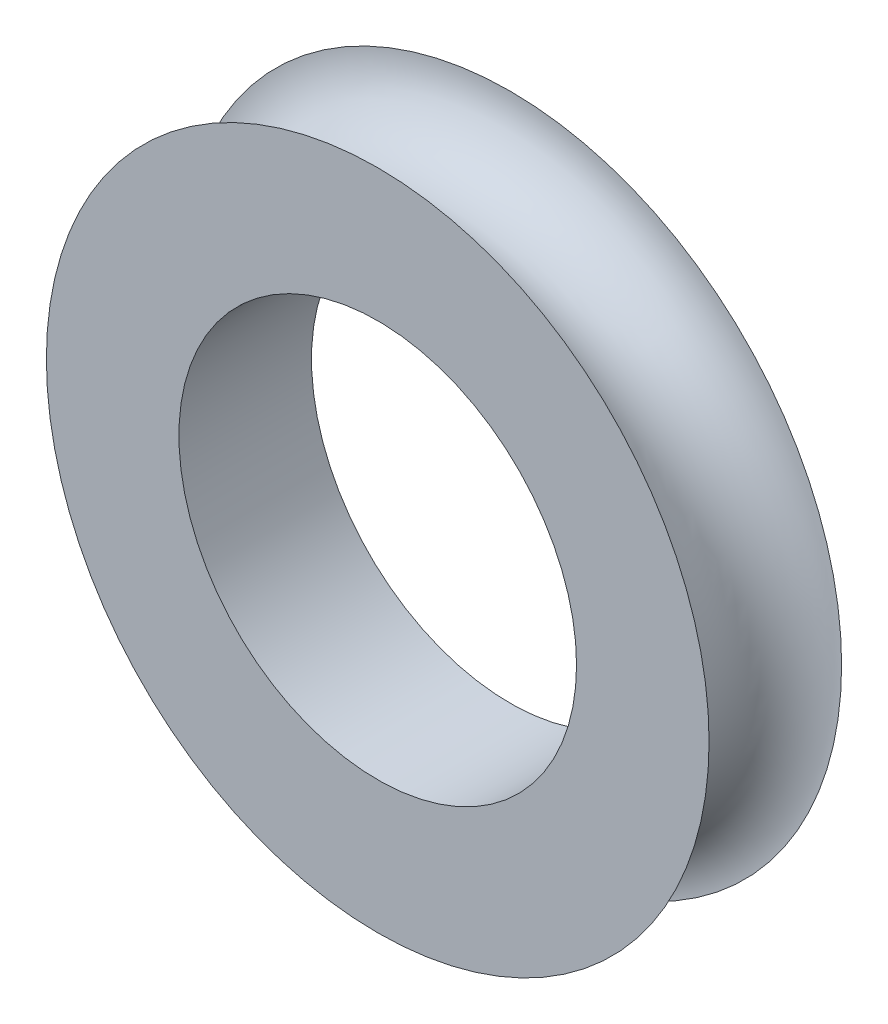
ISO-10303-21;
HEADER;
FILE_DESCRIPTION(('STEP AP214'),'2;1');
FILE_NAME('part.step','',(''),(''),'','','');
FILE_SCHEMA(('AUTOMOTIVE_DESIGN { 1 0 10303 214 1 1 1 1 }'));
ENDSEC;
DATA;
#1=APPLICATION_CONTEXT('core data for automotive mechanical design processes');
#2=APPLICATION_PROTOCOL_DEFINITION('international standard','automotive_design',2000,#1);
#3=PRODUCT_CONTEXT('',#1,'mechanical');
#4=PRODUCT('Part','Part','',(#3));
#5=PRODUCT_RELATED_PRODUCT_CATEGORY('part','',(#4));
#6=PRODUCT_DEFINITION_FORMATION('','',#4);
#7=PRODUCT_DEFINITION_CONTEXT('part definition',#1,'design');
#8=PRODUCT_DEFINITION('design','',#6,#7);
#9=PRODUCT_DEFINITION_SHAPE('','',#8);
#10=(LENGTH_UNIT() NAMED_UNIT(*) SI_UNIT(.MILLI.,.METRE.));
#11=(NAMED_UNIT(*) PLANE_ANGLE_UNIT() SI_UNIT($,.RADIAN.));
#12=(NAMED_UNIT(*) SI_UNIT($,.STERADIAN.) SOLID_ANGLE_UNIT());
#13=UNCERTAINTY_MEASURE_WITH_UNIT(LENGTH_MEASURE(1.E-05),#10,'distance_accuracy_value','');
#14=(GEOMETRIC_REPRESENTATION_CONTEXT(3) GLOBAL_UNCERTAINTY_ASSIGNED_CONTEXT((#13)) GLOBAL_UNIT_ASSIGNED_CONTEXT((#10,
#11,#12)) REPRESENTATION_CONTEXT('',''));
#15=CARTESIAN_POINT('',(0.,0.,0.));
#16=DIRECTION('',(0.,0.,1.));
#17=DIRECTION('',(1.,0.,0.));
#18=AXIS2_PLACEMENT_3D('',#15,#16,#17);
#19=CARTESIAN_POINT('',(0.,0.,2.));
#20=DIRECTION('',(0.,0.,1.));
#21=DIRECTION('',(1.,0.,0.));
#22=AXIS2_PLACEMENT_3D('',#19,#20,#21);
#23=PLANE('',#22);
#24=CARTESIAN_POINT('',(0.,0.,2.));
#25=DIRECTION('',(0.,0.,1.));
#26=DIRECTION('',(1.,0.,0.));
#27=AXIS2_PLACEMENT_3D('',#24,#25,#26);
#28=CIRCLE('',#27,5.);
#29=CARTESIAN_POINT('',(5.,0.,2.));
#30=VERTEX_POINT('',#29);
#31=EDGE_CURVE('E46',#30,#30,#28,.T.);
#32=ORIENTED_EDGE('',*,*,#31,.T.);
#33=EDGE_LOOP('',(#32));
#34=FACE_BOUND('',#33,.T.);
#35=CARTESIAN_POINT('',(0.,0.,2.));
#36=DIRECTION('',(0.,0.,1.));
#37=DIRECTION('',(1.,0.,0.));
#38=AXIS2_PLACEMENT_3D('',#35,#36,#37);
#39=CIRCLE('',#38,3.);
#40=CARTESIAN_POINT('',(3.,0.,2.));
#41=VERTEX_POINT('',#40);
#42=EDGE_CURVE('E10',#41,#41,#39,.T.);
#43=ORIENTED_EDGE('',*,*,#42,.F.);
#44=EDGE_LOOP('',(#43));
#45=FACE_BOUND('',#44,.T.);
#46=ADVANCED_FACE('F31',(#34,#45),#23,.T.);
#47=CARTESIAN_POINT('',(0.,0.,0.));
#48=DIRECTION('',(0.,0.,1.));
#49=DIRECTION('',(1.,0.,0.));
#50=AXIS2_PLACEMENT_3D('',#47,#48,#49);
#51=PLANE('',#50);
#52=CARTESIAN_POINT('',(0.,0.,0.));
#53=DIRECTION('',(0.,0.,1.));
#54=DIRECTION('',(1.,0.,0.));
#55=AXIS2_PLACEMENT_3D('',#52,#53,#54);
#56=CIRCLE('',#55,5.);
#57=CARTESIAN_POINT('',(5.,0.,0.));
#58=VERTEX_POINT('',#57);
#59=EDGE_CURVE('E42',#58,#58,#56,.T.);
#60=ORIENTED_EDGE('',*,*,#59,.F.);
#61=EDGE_LOOP('',(#60));
#62=FACE_BOUND('',#61,.T.);
#63=CARTESIAN_POINT('',(0.,0.,0.));
#64=DIRECTION('',(0.,0.,1.));
#65=DIRECTION('',(1.,0.,0.));
#66=AXIS2_PLACEMENT_3D('',#63,#64,#65);
#67=CIRCLE('',#66,3.);
#68=CARTESIAN_POINT('',(3.,0.,0.));
#69=VERTEX_POINT('',#68);
#70=EDGE_CURVE('E35',#69,#69,#67,.T.);
#71=ORIENTED_EDGE('',*,*,#70,.T.);
#72=EDGE_LOOP('',(#71));
#73=FACE_BOUND('',#72,.T.);
#74=ADVANCED_FACE('F33',(#62,#73),#51,.F.);
#75=CARTESIAN_POINT('',(0.,0.,2.));
#76=DIRECTION('',(0.,0.,-1.));
#77=DIRECTION('',(-1.,0.,0.));
#78=AXIS2_PLACEMENT_3D('',#75,#76,#77);
#79=CYLINDRICAL_SURFACE('',#78,3.);
#80=ORIENTED_EDGE('',*,*,#42,.T.);
#81=EDGE_LOOP('',(#80));
#82=FACE_BOUND('',#81,.T.);
#83=ORIENTED_EDGE('',*,*,#70,.F.);
#84=EDGE_LOOP('',(#83));
#85=FACE_BOUND('',#84,.T.);
#86=ADVANCED_FACE('F54',(#82,#85),#79,.F.);
#87=CARTESIAN_POINT('',(0.,0.,1.));
#88=DIRECTION('',(0.,0.,1.));
#89=DIRECTION('',(1.,0.,0.));
#90=AXIS2_PLACEMENT_3D('',#87,#88,#89);
#91=TOROIDAL_SURFACE('',#90,5.,1.);
#92=ORIENTED_EDGE('',*,*,#59,.T.);
#93=EDGE_LOOP('',(#92));
#94=FACE_BOUND('',#93,.T.);
#95=ORIENTED_EDGE('',*,*,#31,.F.);
#96=EDGE_LOOP('',(#95));
#97=FACE_BOUND('',#96,.T.);
#98=ADVANCED_FACE('F52',(#94,#97),#91,.F.);
#99=CLOSED_SHELL('',(#46,#74,#86,#98));
#100=MANIFOLD_SOLID_BREP('B2',#99);
#101=ADVANCED_BREP_SHAPE_REPRESENTATION('',(#18,#100),#14);
#102=SHAPE_DEFINITION_REPRESENTATION(#9,#101);
ENDSEC;
END-ISO-10303-21;
